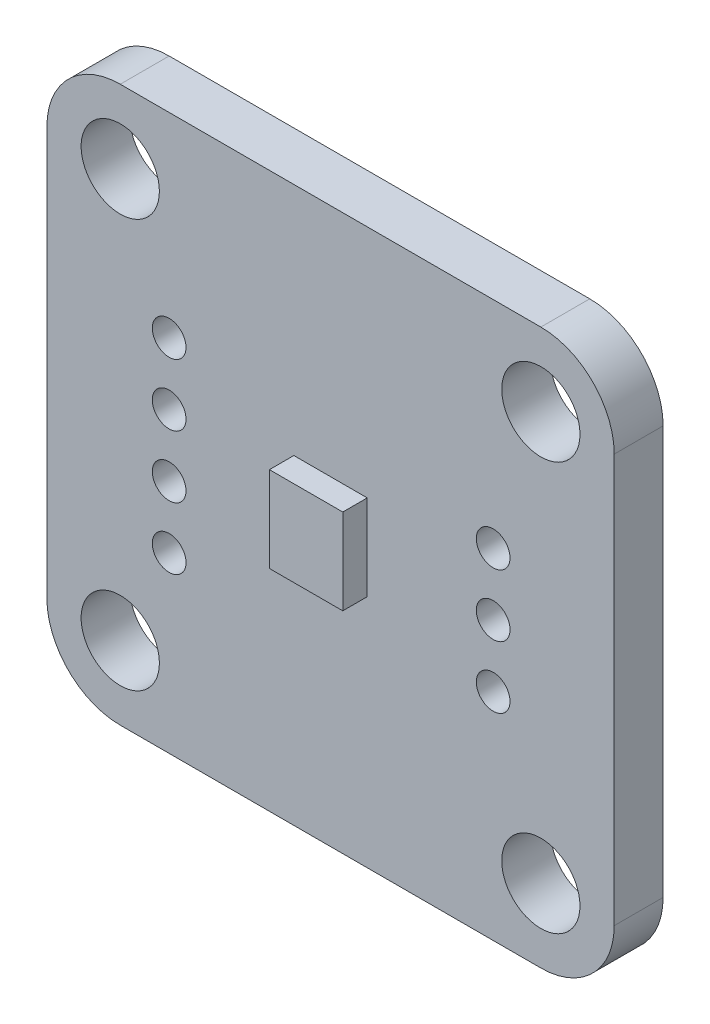
ISO-10303-21;
HEADER;
FILE_DESCRIPTION(('STEP AP214'),'2;1');
FILE_NAME('part.step','',(''),(''),'','','');
FILE_SCHEMA(('AUTOMOTIVE_DESIGN { 1 0 10303 214 1 1 1 1 }'));
ENDSEC;
DATA;
#1=APPLICATION_CONTEXT('core data for automotive mechanical design processes');
#2=APPLICATION_PROTOCOL_DEFINITION('international standard','automotive_design',2000,#1);
#3=PRODUCT_CONTEXT('',#1,'mechanical');
#4=PRODUCT('Part','Part','',(#3));
#5=PRODUCT_RELATED_PRODUCT_CATEGORY('part','',(#4));
#6=PRODUCT_DEFINITION_FORMATION('','',#4);
#7=PRODUCT_DEFINITION_CONTEXT('part definition',#1,'design');
#8=PRODUCT_DEFINITION('design','',#6,#7);
#9=PRODUCT_DEFINITION_SHAPE('','',#8);
#10=(LENGTH_UNIT() NAMED_UNIT(*) SI_UNIT(.MILLI.,.METRE.));
#11=(NAMED_UNIT(*) PLANE_ANGLE_UNIT() SI_UNIT($,.RADIAN.));
#12=(NAMED_UNIT(*) SI_UNIT($,.STERADIAN.) SOLID_ANGLE_UNIT());
#13=UNCERTAINTY_MEASURE_WITH_UNIT(LENGTH_MEASURE(1.E-05),#10,'distance_accuracy_value','');
#14=(GEOMETRIC_REPRESENTATION_CONTEXT(3) GLOBAL_UNCERTAINTY_ASSIGNED_CONTEXT((#13)) GLOBAL_UNIT_ASSIGNED_CONTEXT((#10,
#11,#12)) REPRESENTATION_CONTEXT('',''));
#15=CARTESIAN_POINT('',(0.,0.,0.));
#16=DIRECTION('',(0.,0.,1.));
#17=DIRECTION('',(1.,0.,0.));
#18=AXIS2_PLACEMENT_3D('',#15,#16,#17);
#19=CARTESIAN_POINT('',(-8.6,8.35,2.));
#20=DIRECTION('',(0.,0.,1.));
#21=DIRECTION('',(1.,0.,0.));
#22=AXIS2_PLACEMENT_3D('',#19,#20,#21);
#23=PLANE('',#22);
#24=CARTESIAN_POINT('',(-6.6,-4.25000000000001,2.));
#25=DIRECTION('',(0.,0.,1.));
#26=DIRECTION('',(1.,0.,0.));
#27=AXIS2_PLACEMENT_3D('',#24,#25,#26);
#28=CIRCLE('',#27,0.69);
#29=CARTESIAN_POINT('',(-5.91,-4.25000000000001,2.));
#30=VERTEX_POINT('',#29);
#31=EDGE_CURVE('E238',#30,#30,#28,.T.);
#32=ORIENTED_EDGE('',*,*,#31,.F.);
#33=EDGE_LOOP('',(#32));
#34=FACE_BOUND('',#33,.T.);
#35=CARTESIAN_POINT('',(6.65,-2.54,2.));
#36=DIRECTION('',(0.,0.,1.));
#37=DIRECTION('',(1.,0.,0.));
#38=AXIS2_PLACEMENT_3D('',#35,#36,#37);
#39=CIRCLE('',#38,0.69);
#40=CARTESIAN_POINT('',(7.34,-2.54,2.));
#41=VERTEX_POINT('',#40);
#42=EDGE_CURVE('E254',#41,#41,#39,.T.);
#43=ORIENTED_EDGE('',*,*,#42,.F.);
#44=EDGE_LOOP('',(#43));
#45=FACE_BOUND('',#44,.T.);
#46=CARTESIAN_POINT('',(6.65,2.54,2.));
#47=DIRECTION('',(0.,0.,1.));
#48=DIRECTION('',(1.,0.,0.));
#49=AXIS2_PLACEMENT_3D('',#46,#47,#48);
#50=CIRCLE('',#49,0.69);
#51=CARTESIAN_POINT('',(7.34,2.54,2.));
#52=VERTEX_POINT('',#51);
#53=EDGE_CURVE('E243',#52,#52,#50,.T.);
#54=ORIENTED_EDGE('',*,*,#53,.F.);
#55=EDGE_LOOP('',(#54));
#56=FACE_BOUND('',#55,.T.);
#57=CARTESIAN_POINT('',(-6.59999999999999,-1.71000000000001,2.));
#58=DIRECTION('',(0.,0.,1.));
#59=DIRECTION('',(1.,0.,0.));
#60=AXIS2_PLACEMENT_3D('',#57,#58,#59);
#61=CIRCLE('',#60,0.69);
#62=CARTESIAN_POINT('',(-5.90999999999999,-1.71000000000001,2.));
#63=VERTEX_POINT('',#62);
#64=EDGE_CURVE('E235',#63,#63,#61,.T.);
#65=ORIENTED_EDGE('',*,*,#64,.F.);
#66=EDGE_LOOP('',(#65));
#67=FACE_BOUND('',#66,.T.);
#68=CARTESIAN_POINT('',(-6.59999999999999,0.829999999999995,2.));
#69=DIRECTION('',(0.,0.,1.));
#70=DIRECTION('',(1.,0.,0.));
#71=AXIS2_PLACEMENT_3D('',#68,#69,#70);
#72=CIRCLE('',#71,0.69);
#73=CARTESIAN_POINT('',(-5.90999999999999,0.829999999999995,2.));
#74=VERTEX_POINT('',#73);
#75=EDGE_CURVE('E228',#74,#74,#72,.T.);
#76=ORIENTED_EDGE('',*,*,#75,.F.);
#77=EDGE_LOOP('',(#76));
#78=FACE_BOUND('',#77,.T.);
#79=CARTESIAN_POINT('',(-6.59999999999999,3.36999999999999,2.));
#80=DIRECTION('',(0.,0.,1.));
#81=DIRECTION('',(1.,0.,0.));
#82=AXIS2_PLACEMENT_3D('',#79,#80,#81);
#83=CIRCLE('',#82,0.69);
#84=CARTESIAN_POINT('',(-5.90999999999999,3.36999999999999,2.));
#85=VERTEX_POINT('',#84);
#86=EDGE_CURVE('E229',#85,#85,#83,.T.);
#87=ORIENTED_EDGE('',*,*,#86,.F.);
#88=EDGE_LOOP('',(#87));
#89=FACE_BOUND('',#88,.T.);
#90=CARTESIAN_POINT('',(6.65,0.,2.));
#91=DIRECTION('',(0.,0.,1.));
#92=DIRECTION('',(1.,0.,0.));
#93=AXIS2_PLACEMENT_3D('',#90,#91,#92);
#94=CIRCLE('',#93,0.69);
#95=CARTESIAN_POINT('',(7.34,0.,2.));
#96=VERTEX_POINT('',#95);
#97=EDGE_CURVE('E242',#96,#96,#94,.T.);
#98=ORIENTED_EDGE('',*,*,#97,.F.);
#99=EDGE_LOOP('',(#98));
#100=FACE_BOUND('',#99,.T.);
#101=CARTESIAN_POINT('',(8.6,8.35,2.));
#102=DIRECTION('',(0.,0.,1.));
#103=DIRECTION('',(1.,0.,0.));
#104=AXIS2_PLACEMENT_3D('',#101,#102,#103);
#105=CIRCLE('',#104,1.6);
#106=CARTESIAN_POINT('',(10.2,8.35,2.));
#107=VERTEX_POINT('',#106);
#108=EDGE_CURVE('E210',#107,#107,#105,.T.);
#109=ORIENTED_EDGE('',*,*,#108,.F.);
#110=EDGE_LOOP('',(#109));
#111=FACE_BOUND('',#110,.T.);
#112=CARTESIAN_POINT('',(-8.6,8.35,2.));
#113=DIRECTION('',(0.,0.,1.));
#114=DIRECTION('',(1.,0.,0.));
#115=AXIS2_PLACEMENT_3D('',#112,#113,#114);
#116=CIRCLE('',#115,1.6);
#117=CARTESIAN_POINT('',(-7.,8.35,2.));
#118=VERTEX_POINT('',#117);
#119=EDGE_CURVE('E155',#118,#118,#116,.T.);
#120=ORIENTED_EDGE('',*,*,#119,.F.);
#121=EDGE_LOOP('',(#120));
#122=FACE_BOUND('',#121,.T.);
#123=CARTESIAN_POINT('',(-8.6,8.35,2.));
#124=DIRECTION('',(0.,0.,1.));
#125=DIRECTION('',(1.,0.,0.));
#126=AXIS2_PLACEMENT_3D('',#123,#124,#125);
#127=CIRCLE('',#126,3.);
#128=CARTESIAN_POINT('',(-8.59999999999997,11.35,2.));
#129=VERTEX_POINT('',#128);
#130=CARTESIAN_POINT('',(-11.6,8.34999999999997,2.));
#131=VERTEX_POINT('',#130);
#132=EDGE_CURVE('E167',#129,#131,#127,.T.);
#133=ORIENTED_EDGE('',*,*,#132,.T.);
#134=DIRECTION('',(0.,-1.,0.));
#135=VECTOR('',#134,1.);
#136=CARTESIAN_POINT('',(-11.6,-8.34999999999998,2.));
#137=LINE('',#136,#135);
#138=CARTESIAN_POINT('',(-11.6,-8.35,2.));
#139=VERTEX_POINT('',#138);
#140=EDGE_CURVE('E107',#131,#139,#137,.T.);
#141=ORIENTED_EDGE('',*,*,#140,.T.);
#142=CARTESIAN_POINT('',(-8.6,-8.35,2.));
#143=DIRECTION('',(0.,0.,1.));
#144=DIRECTION('',(-1.,0.,0.));
#145=AXIS2_PLACEMENT_3D('',#142,#143,#144);
#146=CIRCLE('',#145,3.);
#147=CARTESIAN_POINT('',(-8.59999999999998,-11.35,2.));
#148=VERTEX_POINT('',#147);
#149=EDGE_CURVE('E182',#139,#148,#146,.T.);
#150=ORIENTED_EDGE('',*,*,#149,.T.);
#151=DIRECTION('',(1.,0.,0.));
#152=VECTOR('',#151,1.);
#153=CARTESIAN_POINT('',(8.59999999999998,-11.35,2.));
#154=LINE('',#153,#152);
#155=CARTESIAN_POINT('',(8.59999999999998,-11.35,2.));
#156=VERTEX_POINT('',#155);
#157=EDGE_CURVE('E195',#148,#156,#154,.T.);
#158=ORIENTED_EDGE('',*,*,#157,.T.);
#159=CARTESIAN_POINT('',(8.6,-8.35,2.));
#160=DIRECTION('',(0.,0.,1.));
#161=DIRECTION('',(1.,0.,0.));
#162=AXIS2_PLACEMENT_3D('',#159,#160,#161);
#163=CIRCLE('',#162,3.);
#164=CARTESIAN_POINT('',(11.6,-8.34999999999998,2.));
#165=VERTEX_POINT('',#164);
#166=EDGE_CURVE('E130',#156,#165,#163,.T.);
#167=ORIENTED_EDGE('',*,*,#166,.T.);
#168=DIRECTION('',(0.,1.,0.));
#169=VECTOR('',#168,1.);
#170=CARTESIAN_POINT('',(11.6,-8.34999999999998,2.));
#171=LINE('',#170,#169);
#172=CARTESIAN_POINT('',(11.6,8.34999999999997,2.));
#173=VERTEX_POINT('',#172);
#174=EDGE_CURVE('E123',#165,#173,#171,.T.);
#175=ORIENTED_EDGE('',*,*,#174,.T.);
#176=CARTESIAN_POINT('',(8.6,8.35,2.));
#177=DIRECTION('',(0.,0.,1.));
#178=DIRECTION('',(1.,0.,0.));
#179=AXIS2_PLACEMENT_3D('',#176,#177,#178);
#180=CIRCLE('',#179,3.);
#181=CARTESIAN_POINT('',(8.59999999999998,11.35,2.));
#182=VERTEX_POINT('',#181);
#183=EDGE_CURVE('E127',#173,#182,#180,.T.);
#184=ORIENTED_EDGE('',*,*,#183,.T.);
#185=DIRECTION('',(-1.,0.,0.));
#186=VECTOR('',#185,1.);
#187=CARTESIAN_POINT('',(8.59999999999998,11.35,2.));
#188=LINE('',#187,#186);
#189=EDGE_CURVE('E66',#182,#129,#188,.T.);
#190=ORIENTED_EDGE('',*,*,#189,.T.);
#191=EDGE_LOOP('',(#133,#141,#150,#158,#167,#175,#184,#190));
#192=FACE_BOUND('',#191,.T.);
#193=CARTESIAN_POINT('',(-8.6,-8.35,2.));
#194=DIRECTION('',(0.,0.,1.));
#195=DIRECTION('',(1.,0.,0.));
#196=AXIS2_PLACEMENT_3D('',#193,#194,#195);
#197=CIRCLE('',#196,1.6);
#198=CARTESIAN_POINT('',(-7.,-8.35,2.));
#199=VERTEX_POINT('',#198);
#200=EDGE_CURVE('E204',#199,#199,#197,.T.);
#201=ORIENTED_EDGE('',*,*,#200,.F.);
#202=EDGE_LOOP('',(#201));
#203=FACE_BOUND('',#202,.T.);
#204=CARTESIAN_POINT('',(8.6,-8.35,2.));
#205=DIRECTION('',(0.,0.,1.));
#206=DIRECTION('',(1.,0.,0.));
#207=AXIS2_PLACEMENT_3D('',#204,#205,#206);
#208=CIRCLE('',#207,1.6);
#209=CARTESIAN_POINT('',(10.2,-8.35,2.));
#210=VERTEX_POINT('',#209);
#211=EDGE_CURVE('E216',#210,#210,#208,.T.);
#212=ORIENTED_EDGE('',*,*,#211,.F.);
#213=EDGE_LOOP('',(#212));
#214=FACE_BOUND('',#213,.T.);
#215=DIRECTION('',(-1.,0.,0.));
#216=VECTOR('',#215,1.);
#217=CARTESIAN_POINT('',(-1.5,1.75,2.));
#218=LINE('',#217,#216);
#219=CARTESIAN_POINT('',(1.5,1.75,2.));
#220=VERTEX_POINT('',#219);
#221=CARTESIAN_POINT('',(-1.5,1.75,2.));
#222=VERTEX_POINT('',#221);
#223=EDGE_CURVE('E282',#220,#222,#218,.T.);
#224=ORIENTED_EDGE('',*,*,#223,.F.);
#225=DIRECTION('',(0.,1.,0.));
#226=VECTOR('',#225,1.);
#227=CARTESIAN_POINT('',(1.5,-1.75,2.));
#228=LINE('',#227,#226);
#229=CARTESIAN_POINT('',(1.5,-1.75,2.));
#230=VERTEX_POINT('',#229);
#231=EDGE_CURVE('E285',#230,#220,#228,.T.);
#232=ORIENTED_EDGE('',*,*,#231,.F.);
#233=DIRECTION('',(1.,0.,0.));
#234=VECTOR('',#233,1.);
#235=CARTESIAN_POINT('',(-1.5,-1.75,2.));
#236=LINE('',#235,#234);
#237=CARTESIAN_POINT('',(-1.5,-1.75,2.));
#238=VERTEX_POINT('',#237);
#239=EDGE_CURVE('E277',#238,#230,#236,.T.);
#240=ORIENTED_EDGE('',*,*,#239,.F.);
#241=DIRECTION('',(0.,-1.,0.));
#242=VECTOR('',#241,1.);
#243=CARTESIAN_POINT('',(-1.5,-1.75,2.));
#244=LINE('',#243,#242);
#245=EDGE_CURVE('E280',#222,#238,#244,.T.);
#246=ORIENTED_EDGE('',*,*,#245,.F.);
#247=EDGE_LOOP('',(#224,#232,#240,#246));
#248=FACE_BOUND('',#247,.T.);
#249=ADVANCED_FACE('F42',(#34,#45,#56,#67,#78,#89,#100,#111,#122,#192,#203,#214,#248),#23,.T.);
#250=CARTESIAN_POINT('',(-8.6,8.35,0.));
#251=DIRECTION('',(0.,0.,1.));
#252=DIRECTION('',(1.,0.,0.));
#253=AXIS2_PLACEMENT_3D('',#250,#251,#252);
#254=PLANE('',#253);
#255=CARTESIAN_POINT('',(-6.6,-4.25000000000001,0.));
#256=DIRECTION('',(0.,0.,1.));
#257=DIRECTION('',(1.,0.,0.));
#258=AXIS2_PLACEMENT_3D('',#255,#256,#257);
#259=CIRCLE('',#258,0.69);
#260=CARTESIAN_POINT('',(-5.91,-4.25000000000001,0.));
#261=VERTEX_POINT('',#260);
#262=EDGE_CURVE('E222',#261,#261,#259,.T.);
#263=ORIENTED_EDGE('',*,*,#262,.T.);
#264=EDGE_LOOP('',(#263));
#265=FACE_BOUND('',#264,.T.);
#266=CARTESIAN_POINT('',(6.65,-2.54,0.));
#267=DIRECTION('',(0.,0.,1.));
#268=DIRECTION('',(1.,0.,0.));
#269=AXIS2_PLACEMENT_3D('',#266,#267,#268);
#270=CIRCLE('',#269,0.69);
#271=CARTESIAN_POINT('',(7.34,-2.54,0.));
#272=VERTEX_POINT('',#271);
#273=EDGE_CURVE('E251',#272,#272,#270,.T.);
#274=ORIENTED_EDGE('',*,*,#273,.T.);
#275=EDGE_LOOP('',(#274));
#276=FACE_BOUND('',#275,.T.);
#277=CARTESIAN_POINT('',(6.65,2.54,0.));
#278=DIRECTION('',(0.,0.,1.));
#279=DIRECTION('',(1.,0.,0.));
#280=AXIS2_PLACEMENT_3D('',#277,#278,#279);
#281=CIRCLE('',#280,0.69);
#282=CARTESIAN_POINT('',(7.34,2.54,0.));
#283=VERTEX_POINT('',#282);
#284=EDGE_CURVE('E258',#283,#283,#281,.T.);
#285=ORIENTED_EDGE('',*,*,#284,.T.);
#286=EDGE_LOOP('',(#285));
#287=FACE_BOUND('',#286,.T.);
#288=CARTESIAN_POINT('',(-6.59999999999999,-1.71000000000001,0.));
#289=DIRECTION('',(0.,0.,1.));
#290=DIRECTION('',(1.,0.,0.));
#291=AXIS2_PLACEMENT_3D('',#288,#289,#290);
#292=CIRCLE('',#291,0.69);
#293=CARTESIAN_POINT('',(-5.90999999999999,-1.71000000000001,0.));
#294=VERTEX_POINT('',#293);
#295=EDGE_CURVE('E232',#294,#294,#292,.T.);
#296=ORIENTED_EDGE('',*,*,#295,.T.);
#297=EDGE_LOOP('',(#296));
#298=FACE_BOUND('',#297,.T.);
#299=CARTESIAN_POINT('',(-6.59999999999999,0.829999999999995,0.));
#300=DIRECTION('',(0.,0.,1.));
#301=DIRECTION('',(1.,0.,0.));
#302=AXIS2_PLACEMENT_3D('',#299,#300,#301);
#303=CIRCLE('',#302,0.69);
#304=CARTESIAN_POINT('',(-5.90999999999999,0.829999999999995,0.));
#305=VERTEX_POINT('',#304);
#306=EDGE_CURVE('E225',#305,#305,#303,.T.);
#307=ORIENTED_EDGE('',*,*,#306,.T.);
#308=EDGE_LOOP('',(#307));
#309=FACE_BOUND('',#308,.T.);
#310=CARTESIAN_POINT('',(-6.59999999999999,3.36999999999999,0.));
#311=DIRECTION('',(0.,0.,1.));
#312=DIRECTION('',(1.,0.,0.));
#313=AXIS2_PLACEMENT_3D('',#310,#311,#312);
#314=CIRCLE('',#313,0.69);
#315=CARTESIAN_POINT('',(-5.90999999999999,3.36999999999999,0.));
#316=VERTEX_POINT('',#315);
#317=EDGE_CURVE('E246',#316,#316,#314,.T.);
#318=ORIENTED_EDGE('',*,*,#317,.T.);
#319=EDGE_LOOP('',(#318));
#320=FACE_BOUND('',#319,.T.);
#321=CARTESIAN_POINT('',(6.65,0.,0.));
#322=DIRECTION('',(0.,0.,1.));
#323=DIRECTION('',(1.,0.,0.));
#324=AXIS2_PLACEMENT_3D('',#321,#322,#323);
#325=CIRCLE('',#324,0.69);
#326=CARTESIAN_POINT('',(7.34,0.,0.));
#327=VERTEX_POINT('',#326);
#328=EDGE_CURVE('E239',#327,#327,#325,.T.);
#329=ORIENTED_EDGE('',*,*,#328,.T.);
#330=EDGE_LOOP('',(#329));
#331=FACE_BOUND('',#330,.T.);
#332=CARTESIAN_POINT('',(-8.6,8.35,0.));
#333=DIRECTION('',(0.,0.,1.));
#334=DIRECTION('',(1.,0.,0.));
#335=AXIS2_PLACEMENT_3D('',#332,#333,#334);
#336=CIRCLE('',#335,3.);
#337=CARTESIAN_POINT('',(-8.59999999999997,11.35,0.));
#338=VERTEX_POINT('',#337);
#339=CARTESIAN_POINT('',(-11.6,8.34999999999997,0.));
#340=VERTEX_POINT('',#339);
#341=EDGE_CURVE('E151',#338,#340,#336,.T.);
#342=ORIENTED_EDGE('',*,*,#341,.F.);
#343=DIRECTION('',(-1.,0.,0.));
#344=VECTOR('',#343,1.);
#345=CARTESIAN_POINT('',(8.59999999999998,11.35,0.));
#346=LINE('',#345,#344);
#347=CARTESIAN_POINT('',(8.59999999999998,11.35,0.));
#348=VERTEX_POINT('',#347);
#349=EDGE_CURVE('E99',#348,#338,#346,.T.);
#350=ORIENTED_EDGE('',*,*,#349,.F.);
#351=CARTESIAN_POINT('',(8.6,8.35,0.));
#352=DIRECTION('',(0.,0.,1.));
#353=DIRECTION('',(1.,0.,0.));
#354=AXIS2_PLACEMENT_3D('',#351,#352,#353);
#355=CIRCLE('',#354,3.);
#356=CARTESIAN_POINT('',(11.6,8.34999999999997,0.));
#357=VERTEX_POINT('',#356);
#358=EDGE_CURVE('E164',#357,#348,#355,.T.);
#359=ORIENTED_EDGE('',*,*,#358,.F.);
#360=DIRECTION('',(0.,1.,0.));
#361=VECTOR('',#360,1.);
#362=CARTESIAN_POINT('',(11.6,-8.34999999999998,0.));
#363=LINE('',#362,#361);
#364=CARTESIAN_POINT('',(11.6,-8.34999999999998,0.));
#365=VERTEX_POINT('',#364);
#366=EDGE_CURVE('E139',#365,#357,#363,.T.);
#367=ORIENTED_EDGE('',*,*,#366,.F.);
#368=CARTESIAN_POINT('',(8.6,-8.35,0.));
#369=DIRECTION('',(0.,0.,1.));
#370=DIRECTION('',(1.,0.,0.));
#371=AXIS2_PLACEMENT_3D('',#368,#369,#370);
#372=CIRCLE('',#371,3.);
#373=CARTESIAN_POINT('',(8.59999999999998,-11.35,0.));
#374=VERTEX_POINT('',#373);
#375=EDGE_CURVE('E161',#374,#365,#372,.T.);
#376=ORIENTED_EDGE('',*,*,#375,.F.);
#377=DIRECTION('',(1.,0.,0.));
#378=VECTOR('',#377,1.);
#379=CARTESIAN_POINT('',(8.59999999999998,-11.35,0.));
#380=LINE('',#379,#378);
#381=CARTESIAN_POINT('',(-8.59999999999998,-11.35,0.));
#382=VERTEX_POINT('',#381);
#383=EDGE_CURVE('E159',#382,#374,#380,.T.);
#384=ORIENTED_EDGE('',*,*,#383,.F.);
#385=CARTESIAN_POINT('',(-8.6,-8.35,0.));
#386=DIRECTION('',(0.,0.,1.));
#387=DIRECTION('',(-1.,0.,0.));
#388=AXIS2_PLACEMENT_3D('',#385,#386,#387);
#389=CIRCLE('',#388,3.);
#390=CARTESIAN_POINT('',(-11.6,-8.35,0.));
#391=VERTEX_POINT('',#390);
#392=EDGE_CURVE('E157',#391,#382,#389,.T.);
#393=ORIENTED_EDGE('',*,*,#392,.F.);
#394=DIRECTION('',(0.,-1.,0.));
#395=VECTOR('',#394,1.);
#396=CARTESIAN_POINT('',(-11.6,-8.34999999999998,0.));
#397=LINE('',#396,#395);
#398=EDGE_CURVE('E154',#340,#391,#397,.T.);
#399=ORIENTED_EDGE('',*,*,#398,.F.);
#400=EDGE_LOOP('',(#342,#350,#359,#367,#376,#384,#393,#399));
#401=FACE_BOUND('',#400,.T.);
#402=CARTESIAN_POINT('',(-8.6,8.35,0.));
#403=DIRECTION('',(0.,0.,1.));
#404=DIRECTION('',(1.,0.,0.));
#405=AXIS2_PLACEMENT_3D('',#402,#403,#404);
#406=CIRCLE('',#405,1.6);
#407=CARTESIAN_POINT('',(-7.,8.35,0.));
#408=VERTEX_POINT('',#407);
#409=EDGE_CURVE('E201',#408,#408,#406,.T.);
#410=ORIENTED_EDGE('',*,*,#409,.T.);
#411=EDGE_LOOP('',(#410));
#412=FACE_BOUND('',#411,.T.);
#413=CARTESIAN_POINT('',(-8.6,-8.35,0.));
#414=DIRECTION('',(0.,0.,1.));
#415=DIRECTION('',(1.,0.,0.));
#416=AXIS2_PLACEMENT_3D('',#413,#414,#415);
#417=CIRCLE('',#416,1.6);
#418=CARTESIAN_POINT('',(-7.,-8.35,0.));
#419=VERTEX_POINT('',#418);
#420=EDGE_CURVE('E207',#419,#419,#417,.T.);
#421=ORIENTED_EDGE('',*,*,#420,.T.);
#422=EDGE_LOOP('',(#421));
#423=FACE_BOUND('',#422,.T.);
#424=CARTESIAN_POINT('',(8.6,8.35,0.));
#425=DIRECTION('',(0.,0.,1.));
#426=DIRECTION('',(1.,0.,0.));
#427=AXIS2_PLACEMENT_3D('',#424,#425,#426);
#428=CIRCLE('',#427,1.6);
#429=CARTESIAN_POINT('',(10.2,8.35,0.));
#430=VERTEX_POINT('',#429);
#431=EDGE_CURVE('E213',#430,#430,#428,.T.);
#432=ORIENTED_EDGE('',*,*,#431,.T.);
#433=EDGE_LOOP('',(#432));
#434=FACE_BOUND('',#433,.T.);
#435=CARTESIAN_POINT('',(8.6,-8.35,0.));
#436=DIRECTION('',(0.,0.,1.));
#437=DIRECTION('',(1.,0.,0.));
#438=AXIS2_PLACEMENT_3D('',#435,#436,#437);
#439=CIRCLE('',#438,1.6);
#440=CARTESIAN_POINT('',(10.2,-8.35,0.));
#441=VERTEX_POINT('',#440);
#442=EDGE_CURVE('E219',#441,#441,#439,.T.);
#443=ORIENTED_EDGE('',*,*,#442,.T.);
#444=EDGE_LOOP('',(#443));
#445=FACE_BOUND('',#444,.T.);
#446=ADVANCED_FACE('F186',(#265,#276,#287,#298,#309,#320,#331,#401,#412,#423,#434,#445),#254,.F.);
#447=CARTESIAN_POINT('',(-8.6,8.35,2.));
#448=DIRECTION('',(0.,0.,-1.));
#449=DIRECTION('',(-1.,0.,0.));
#450=AXIS2_PLACEMENT_3D('',#447,#448,#449);
#451=CYLINDRICAL_SURFACE('',#450,3.);
#452=ORIENTED_EDGE('',*,*,#341,.T.);
#453=DIRECTION('',(0.,0.,-1.));
#454=VECTOR('',#453,1.);
#455=CARTESIAN_POINT('',(-11.6,8.34999999999997,2.));
#456=LINE('',#455,#454);
#457=EDGE_CURVE('E11',#131,#340,#456,.T.);
#458=ORIENTED_EDGE('',*,*,#457,.F.);
#459=ORIENTED_EDGE('',*,*,#132,.F.);
#460=DIRECTION('',(0.,0.,-1.));
#461=VECTOR('',#460,1.);
#462=CARTESIAN_POINT('',(-8.59999999999997,11.35,2.));
#463=LINE('',#462,#461);
#464=EDGE_CURVE('E147',#129,#338,#463,.T.);
#465=ORIENTED_EDGE('',*,*,#464,.T.);
#466=EDGE_LOOP('',(#452,#458,#459,#465));
#467=FACE_BOUND('',#466,.T.);
#468=ADVANCED_FACE('F44',(#467),#451,.T.);
#469=CARTESIAN_POINT('',(-11.6,-8.34999999999998,2.));
#470=DIRECTION('',(1.,0.,0.));
#471=DIRECTION('',(0.,1.,0.));
#472=AXIS2_PLACEMENT_3D('',#469,#470,#471);
#473=PLANE('',#472);
#474=ORIENTED_EDGE('',*,*,#398,.T.);
#475=DIRECTION('',(0.,0.,-1.));
#476=VECTOR('',#475,1.);
#477=CARTESIAN_POINT('',(-11.6,-8.35,2.));
#478=LINE('',#477,#476);
#479=EDGE_CURVE('E50',#139,#391,#478,.T.);
#480=ORIENTED_EDGE('',*,*,#479,.F.);
#481=ORIENTED_EDGE('',*,*,#140,.F.);
#482=ORIENTED_EDGE('',*,*,#457,.T.);
#483=EDGE_LOOP('',(#474,#480,#481,#482));
#484=FACE_BOUND('',#483,.T.);
#485=ADVANCED_FACE('F353',(#484),#473,.F.);
#486=CARTESIAN_POINT('',(-8.6,-8.35,2.));
#487=DIRECTION('',(0.,0.,-1.));
#488=DIRECTION('',(-1.,0.,0.));
#489=AXIS2_PLACEMENT_3D('',#486,#487,#488);
#490=CYLINDRICAL_SURFACE('',#489,3.);
#491=ORIENTED_EDGE('',*,*,#392,.T.);
#492=DIRECTION('',(0.,0.,-1.));
#493=VECTOR('',#492,1.);
#494=CARTESIAN_POINT('',(-8.59999999999998,-11.35,2.));
#495=LINE('',#494,#493);
#496=EDGE_CURVE('E174',#148,#382,#495,.T.);
#497=ORIENTED_EDGE('',*,*,#496,.F.);
#498=ORIENTED_EDGE('',*,*,#149,.F.);
#499=ORIENTED_EDGE('',*,*,#479,.T.);
#500=EDGE_LOOP('',(#491,#497,#498,#499));
#501=FACE_BOUND('',#500,.T.);
#502=ADVANCED_FACE('F180',(#501),#490,.T.);
#503=CARTESIAN_POINT('',(8.59999999999998,-11.35,2.));
#504=DIRECTION('',(0.,1.,0.));
#505=DIRECTION('',(-1.,0.,0.));
#506=AXIS2_PLACEMENT_3D('',#503,#504,#505);
#507=PLANE('',#506);
#508=ORIENTED_EDGE('',*,*,#383,.T.);
#509=DIRECTION('',(0.,0.,-1.));
#510=VECTOR('',#509,1.);
#511=CARTESIAN_POINT('',(8.59999999999998,-11.35,2.));
#512=LINE('',#511,#510);
#513=EDGE_CURVE('E171',#156,#374,#512,.T.);
#514=ORIENTED_EDGE('',*,*,#513,.F.);
#515=ORIENTED_EDGE('',*,*,#157,.F.);
#516=ORIENTED_EDGE('',*,*,#496,.T.);
#517=EDGE_LOOP('',(#508,#514,#515,#516));
#518=FACE_BOUND('',#517,.T.);
#519=ADVANCED_FACE('F191',(#518),#507,.F.);
#520=CARTESIAN_POINT('',(8.6,-8.35,2.));
#521=DIRECTION('',(0.,0.,-1.));
#522=DIRECTION('',(-1.,0.,0.));
#523=AXIS2_PLACEMENT_3D('',#520,#521,#522);
#524=CYLINDRICAL_SURFACE('',#523,3.);
#525=ORIENTED_EDGE('',*,*,#375,.T.);
#526=DIRECTION('',(0.,0.,-1.));
#527=VECTOR('',#526,1.);
#528=CARTESIAN_POINT('',(11.6,-8.34999999999998,2.));
#529=LINE('',#528,#527);
#530=EDGE_CURVE('E142',#165,#365,#529,.T.);
#531=ORIENTED_EDGE('',*,*,#530,.F.);
#532=ORIENTED_EDGE('',*,*,#166,.F.);
#533=ORIENTED_EDGE('',*,*,#513,.T.);
#534=EDGE_LOOP('',(#525,#531,#532,#533));
#535=FACE_BOUND('',#534,.T.);
#536=ADVANCED_FACE('F194',(#535),#524,.T.);
#537=CARTESIAN_POINT('',(11.6,-8.34999999999998,2.));
#538=DIRECTION('',(-1.,0.,0.));
#539=DIRECTION('',(0.,0.,1.));
#540=AXIS2_PLACEMENT_3D('',#537,#538,#539);
#541=PLANE('',#540);
#542=ORIENTED_EDGE('',*,*,#366,.T.);
#543=DIRECTION('',(0.,0.,-1.));
#544=VECTOR('',#543,1.);
#545=CARTESIAN_POINT('',(11.6,8.34999999999997,2.));
#546=LINE('',#545,#544);
#547=EDGE_CURVE('E136',#173,#357,#546,.T.);
#548=ORIENTED_EDGE('',*,*,#547,.F.);
#549=ORIENTED_EDGE('',*,*,#174,.F.);
#550=ORIENTED_EDGE('',*,*,#530,.T.);
#551=EDGE_LOOP('',(#542,#548,#549,#550));
#552=FACE_BOUND('',#551,.T.);
#553=ADVANCED_FACE('F137',(#552),#541,.F.);
#554=CARTESIAN_POINT('',(8.6,8.35,2.));
#555=DIRECTION('',(0.,0.,-1.));
#556=DIRECTION('',(-1.,0.,0.));
#557=AXIS2_PLACEMENT_3D('',#554,#555,#556);
#558=CYLINDRICAL_SURFACE('',#557,3.);
#559=ORIENTED_EDGE('',*,*,#358,.T.);
#560=DIRECTION('',(0.,0.,-1.));
#561=VECTOR('',#560,1.);
#562=CARTESIAN_POINT('',(8.59999999999998,11.35,2.));
#563=LINE('',#562,#561);
#564=EDGE_CURVE('E143',#182,#348,#563,.T.);
#565=ORIENTED_EDGE('',*,*,#564,.F.);
#566=ORIENTED_EDGE('',*,*,#183,.F.);
#567=ORIENTED_EDGE('',*,*,#547,.T.);
#568=EDGE_LOOP('',(#559,#565,#566,#567));
#569=FACE_BOUND('',#568,.T.);
#570=ADVANCED_FACE('F145',(#569),#558,.T.);
#571=CARTESIAN_POINT('',(8.59999999999998,11.35,2.));
#572=DIRECTION('',(0.,-1.,0.));
#573=DIRECTION('',(1.,0.,0.));
#574=AXIS2_PLACEMENT_3D('',#571,#572,#573);
#575=PLANE('',#574);
#576=ORIENTED_EDGE('',*,*,#349,.T.);
#577=ORIENTED_EDGE('',*,*,#464,.F.);
#578=ORIENTED_EDGE('',*,*,#189,.F.);
#579=ORIENTED_EDGE('',*,*,#564,.T.);
#580=EDGE_LOOP('',(#576,#577,#578,#579));
#581=FACE_BOUND('',#580,.T.);
#582=ADVANCED_FACE('F341',(#581),#575,.F.);
#583=CARTESIAN_POINT('',(-8.6,8.35,2.));
#584=DIRECTION('',(0.,0.,-1.));
#585=DIRECTION('',(-1.,0.,0.));
#586=AXIS2_PLACEMENT_3D('',#583,#584,#585);
#587=CYLINDRICAL_SURFACE('',#586,1.6);
#588=ORIENTED_EDGE('',*,*,#119,.T.);
#589=EDGE_LOOP('',(#588));
#590=FACE_BOUND('',#589,.T.);
#591=ORIENTED_EDGE('',*,*,#409,.F.);
#592=EDGE_LOOP('',(#591));
#593=FACE_BOUND('',#592,.T.);
#594=ADVANCED_FACE('F338',(#590,#593),#587,.F.);
#595=CARTESIAN_POINT('',(-8.6,-8.35,2.));
#596=DIRECTION('',(0.,0.,-1.));
#597=DIRECTION('',(-1.,0.,0.));
#598=AXIS2_PLACEMENT_3D('',#595,#596,#597);
#599=CYLINDRICAL_SURFACE('',#598,1.6);
#600=ORIENTED_EDGE('',*,*,#200,.T.);
#601=EDGE_LOOP('',(#600));
#602=FACE_BOUND('',#601,.T.);
#603=ORIENTED_EDGE('',*,*,#420,.F.);
#604=EDGE_LOOP('',(#603));
#605=FACE_BOUND('',#604,.T.);
#606=ADVANCED_FACE('F514',(#602,#605),#599,.F.);
#607=CARTESIAN_POINT('',(8.6,8.35,2.));
#608=DIRECTION('',(0.,0.,-1.));
#609=DIRECTION('',(-1.,0.,0.));
#610=AXIS2_PLACEMENT_3D('',#607,#608,#609);
#611=CYLINDRICAL_SURFACE('',#610,1.6);
#612=ORIENTED_EDGE('',*,*,#108,.T.);
#613=EDGE_LOOP('',(#612));
#614=FACE_BOUND('',#613,.T.);
#615=ORIENTED_EDGE('',*,*,#431,.F.);
#616=EDGE_LOOP('',(#615));
#617=FACE_BOUND('',#616,.T.);
#618=ADVANCED_FACE('F511',(#614,#617),#611,.F.);
#619=CARTESIAN_POINT('',(8.6,-8.35,2.));
#620=DIRECTION('',(0.,0.,-1.));
#621=DIRECTION('',(-1.,0.,0.));
#622=AXIS2_PLACEMENT_3D('',#619,#620,#621);
#623=CYLINDRICAL_SURFACE('',#622,1.6);
#624=ORIENTED_EDGE('',*,*,#211,.T.);
#625=EDGE_LOOP('',(#624));
#626=FACE_BOUND('',#625,.T.);
#627=ORIENTED_EDGE('',*,*,#442,.F.);
#628=EDGE_LOOP('',(#627));
#629=FACE_BOUND('',#628,.T.);
#630=ADVANCED_FACE('F374',(#626,#629),#623,.F.);
#631=CARTESIAN_POINT('',(6.65,0.,0.));
#632=DIRECTION('',(0.,0.,1.));
#633=DIRECTION('',(1.,0.,0.));
#634=AXIS2_PLACEMENT_3D('',#631,#632,#633);
#635=CYLINDRICAL_SURFACE('',#634,0.69);
#636=ORIENTED_EDGE('',*,*,#328,.F.);
#637=EDGE_LOOP('',(#636));
#638=FACE_BOUND('',#637,.T.);
#639=ORIENTED_EDGE('',*,*,#97,.T.);
#640=EDGE_LOOP('',(#639));
#641=FACE_BOUND('',#640,.T.);
#642=ADVANCED_FACE('F379',(#638,#641),#635,.F.);
#643=CARTESIAN_POINT('',(-6.59999999999999,3.36999999999999,0.));
#644=DIRECTION('',(0.,0.,1.));
#645=DIRECTION('',(1.,0.,0.));
#646=AXIS2_PLACEMENT_3D('',#643,#644,#645);
#647=CYLINDRICAL_SURFACE('',#646,0.69);
#648=ORIENTED_EDGE('',*,*,#317,.F.);
#649=EDGE_LOOP('',(#648));
#650=FACE_BOUND('',#649,.T.);
#651=ORIENTED_EDGE('',*,*,#86,.T.);
#652=EDGE_LOOP('',(#651));
#653=FACE_BOUND('',#652,.T.);
#654=ADVANCED_FACE('F384',(#650,#653),#647,.F.);
#655=CARTESIAN_POINT('',(-6.59999999999999,0.829999999999995,0.));
#656=DIRECTION('',(0.,0.,1.));
#657=DIRECTION('',(1.,0.,0.));
#658=AXIS2_PLACEMENT_3D('',#655,#656,#657);
#659=CYLINDRICAL_SURFACE('',#658,0.69);
#660=ORIENTED_EDGE('',*,*,#306,.F.);
#661=EDGE_LOOP('',(#660));
#662=FACE_BOUND('',#661,.T.);
#663=ORIENTED_EDGE('',*,*,#75,.T.);
#664=EDGE_LOOP('',(#663));
#665=FACE_BOUND('',#664,.T.);
#666=ADVANCED_FACE('F395',(#662,#665),#659,.F.);
#667=CARTESIAN_POINT('',(-6.59999999999999,-1.71000000000001,0.));
#668=DIRECTION('',(0.,0.,1.));
#669=DIRECTION('',(1.,0.,0.));
#670=AXIS2_PLACEMENT_3D('',#667,#668,#669);
#671=CYLINDRICAL_SURFACE('',#670,0.69);
#672=ORIENTED_EDGE('',*,*,#295,.F.);
#673=EDGE_LOOP('',(#672));
#674=FACE_BOUND('',#673,.T.);
#675=ORIENTED_EDGE('',*,*,#64,.T.);
#676=EDGE_LOOP('',(#675));
#677=FACE_BOUND('',#676,.T.);
#678=ADVANCED_FACE('F406',(#674,#677),#671,.F.);
#679=CARTESIAN_POINT('',(6.65,2.54,0.));
#680=DIRECTION('',(0.,0.,1.));
#681=DIRECTION('',(1.,0.,0.));
#682=AXIS2_PLACEMENT_3D('',#679,#680,#681);
#683=CYLINDRICAL_SURFACE('',#682,0.69);
#684=ORIENTED_EDGE('',*,*,#284,.F.);
#685=EDGE_LOOP('',(#684));
#686=FACE_BOUND('',#685,.T.);
#687=ORIENTED_EDGE('',*,*,#53,.T.);
#688=EDGE_LOOP('',(#687));
#689=FACE_BOUND('',#688,.T.);
#690=ADVANCED_FACE('F417',(#686,#689),#683,.F.);
#691=CARTESIAN_POINT('',(6.65,-2.54,0.));
#692=DIRECTION('',(0.,0.,1.));
#693=DIRECTION('',(1.,0.,0.));
#694=AXIS2_PLACEMENT_3D('',#691,#692,#693);
#695=CYLINDRICAL_SURFACE('',#694,0.69);
#696=ORIENTED_EDGE('',*,*,#273,.F.);
#697=EDGE_LOOP('',(#696));
#698=FACE_BOUND('',#697,.T.);
#699=ORIENTED_EDGE('',*,*,#42,.T.);
#700=EDGE_LOOP('',(#699));
#701=FACE_BOUND('',#700,.T.);
#702=ADVANCED_FACE('F428',(#698,#701),#695,.F.);
#703=CARTESIAN_POINT('',(-6.6,-4.25000000000001,0.));
#704=DIRECTION('',(0.,0.,1.));
#705=DIRECTION('',(1.,0.,0.));
#706=AXIS2_PLACEMENT_3D('',#703,#704,#705);
#707=CYLINDRICAL_SURFACE('',#706,0.69);
#708=ORIENTED_EDGE('',*,*,#262,.F.);
#709=EDGE_LOOP('',(#708));
#710=FACE_BOUND('',#709,.T.);
#711=ORIENTED_EDGE('',*,*,#31,.T.);
#712=EDGE_LOOP('',(#711));
#713=FACE_BOUND('',#712,.T.);
#714=ADVANCED_FACE('F439',(#710,#713),#707,.F.);
#715=CARTESIAN_POINT('',(1.5,-1.75,3.));
#716=DIRECTION('',(-1.,0.,0.));
#717=DIRECTION('',(0.,0.,1.));
#718=AXIS2_PLACEMENT_3D('',#715,#716,#717);
#719=PLANE('',#718);
#720=ORIENTED_EDGE('',*,*,#231,.T.);
#721=DIRECTION('',(0.,0.,-1.));
#722=VECTOR('',#721,1.);
#723=CARTESIAN_POINT('',(1.5,1.75,3.));
#724=LINE('',#723,#722);
#725=CARTESIAN_POINT('',(1.5,1.75,3.));
#726=VERTEX_POINT('',#725);
#727=EDGE_CURVE('E255',#726,#220,#724,.T.);
#728=ORIENTED_EDGE('',*,*,#727,.F.);
#729=DIRECTION('',(0.,1.,0.));
#730=VECTOR('',#729,1.);
#731=CARTESIAN_POINT('',(1.5,-1.75,3.));
#732=LINE('',#731,#730);
#733=CARTESIAN_POINT('',(1.5,-1.75,3.));
#734=VERTEX_POINT('',#733);
#735=EDGE_CURVE('E279',#734,#726,#732,.T.);
#736=ORIENTED_EDGE('',*,*,#735,.F.);
#737=DIRECTION('',(0.,0.,-1.));
#738=VECTOR('',#737,1.);
#739=CARTESIAN_POINT('',(1.5,-1.75,3.));
#740=LINE('',#739,#738);
#741=EDGE_CURVE('E273',#734,#230,#740,.T.);
#742=ORIENTED_EDGE('',*,*,#741,.T.);
#743=EDGE_LOOP('',(#720,#728,#736,#742));
#744=FACE_BOUND('',#743,.T.);
#745=ADVANCED_FACE('F308',(#744),#719,.F.);
#746=CARTESIAN_POINT('',(-1.5,1.75,3.));
#747=DIRECTION('',(0.,-1.,0.));
#748=DIRECTION('',(0.,0.,-1.));
#749=AXIS2_PLACEMENT_3D('',#746,#747,#748);
#750=PLANE('',#749);
#751=ORIENTED_EDGE('',*,*,#223,.T.);
#752=DIRECTION('',(0.,0.,-1.));
#753=VECTOR('',#752,1.);
#754=CARTESIAN_POINT('',(-1.5,1.75,3.));
#755=LINE('',#754,#753);
#756=CARTESIAN_POINT('',(-1.5,1.75,3.));
#757=VERTEX_POINT('',#756);
#758=EDGE_CURVE('E269',#757,#222,#755,.T.);
#759=ORIENTED_EDGE('',*,*,#758,.F.);
#760=DIRECTION('',(-1.,0.,0.));
#761=VECTOR('',#760,1.);
#762=CARTESIAN_POINT('',(-1.5,1.75,3.));
#763=LINE('',#762,#761);
#764=EDGE_CURVE('E293',#726,#757,#763,.T.);
#765=ORIENTED_EDGE('',*,*,#764,.F.);
#766=ORIENTED_EDGE('',*,*,#727,.T.);
#767=EDGE_LOOP('',(#751,#759,#765,#766));
#768=FACE_BOUND('',#767,.T.);
#769=ADVANCED_FACE('F313',(#768),#750,.F.);
#770=CARTESIAN_POINT('',(-1.5,-1.75,3.));
#771=DIRECTION('',(1.,0.,0.));
#772=DIRECTION('',(0.,0.,-1.));
#773=AXIS2_PLACEMENT_3D('',#770,#771,#772);
#774=PLANE('',#773);
#775=ORIENTED_EDGE('',*,*,#245,.T.);
#776=DIRECTION('',(0.,0.,-1.));
#777=VECTOR('',#776,1.);
#778=CARTESIAN_POINT('',(-1.5,-1.75,3.));
#779=LINE('',#778,#777);
#780=CARTESIAN_POINT('',(-1.5,-1.75,3.));
#781=VERTEX_POINT('',#780);
#782=EDGE_CURVE('E57',#781,#238,#779,.T.);
#783=ORIENTED_EDGE('',*,*,#782,.F.);
#784=DIRECTION('',(0.,-1.,0.));
#785=VECTOR('',#784,1.);
#786=CARTESIAN_POINT('',(-1.5,-1.75,3.));
#787=LINE('',#786,#785);
#788=EDGE_CURVE('E290',#757,#781,#787,.T.);
#789=ORIENTED_EDGE('',*,*,#788,.F.);
#790=ORIENTED_EDGE('',*,*,#758,.T.);
#791=EDGE_LOOP('',(#775,#783,#789,#790));
#792=FACE_BOUND('',#791,.T.);
#793=ADVANCED_FACE('F322',(#792),#774,.F.);
#794=CARTESIAN_POINT('',(-1.5,-1.75,3.));
#795=DIRECTION('',(0.,1.,0.));
#796=DIRECTION('',(0.,0.,1.));
#797=AXIS2_PLACEMENT_3D('',#794,#795,#796);
#798=PLANE('',#797);
#799=ORIENTED_EDGE('',*,*,#239,.T.);
#800=ORIENTED_EDGE('',*,*,#741,.F.);
#801=DIRECTION('',(1.,0.,0.));
#802=VECTOR('',#801,1.);
#803=CARTESIAN_POINT('',(-1.5,-1.75,3.));
#804=LINE('',#803,#802);
#805=EDGE_CURVE('E276',#781,#734,#804,.T.);
#806=ORIENTED_EDGE('',*,*,#805,.F.);
#807=ORIENTED_EDGE('',*,*,#782,.T.);
#808=EDGE_LOOP('',(#799,#800,#806,#807));
#809=FACE_BOUND('',#808,.T.);
#810=ADVANCED_FACE('F325',(#809),#798,.F.);
#811=CARTESIAN_POINT('',(0.,0.,3.));
#812=DIRECTION('',(0.,0.,-1.));
#813=DIRECTION('',(-1.,0.,0.));
#814=AXIS2_PLACEMENT_3D('',#811,#812,#813);
#815=PLANE('',#814);
#816=ORIENTED_EDGE('',*,*,#735,.T.);
#817=ORIENTED_EDGE('',*,*,#764,.T.);
#818=ORIENTED_EDGE('',*,*,#788,.T.);
#819=ORIENTED_EDGE('',*,*,#805,.T.);
#820=EDGE_LOOP('',(#816,#817,#818,#819));
#821=FACE_BOUND('',#820,.T.);
#822=ADVANCED_FACE('F301',(#821),#815,.F.);
#823=CLOSED_SHELL('',(#249,#446,#468,#485,#502,#519,#536,#553,#570,#582,#594,#606,#618,#630,
#642,#654,#666,#678,#690,#702,#714,#745,#769,#793,#810,#822));
#824=MANIFOLD_SOLID_BREP('B2',#823);
#825=ADVANCED_BREP_SHAPE_REPRESENTATION('',(#18,#824),#14);
#826=SHAPE_DEFINITION_REPRESENTATION(#9,#825);
ENDSEC;
END-ISO-10303-21;
